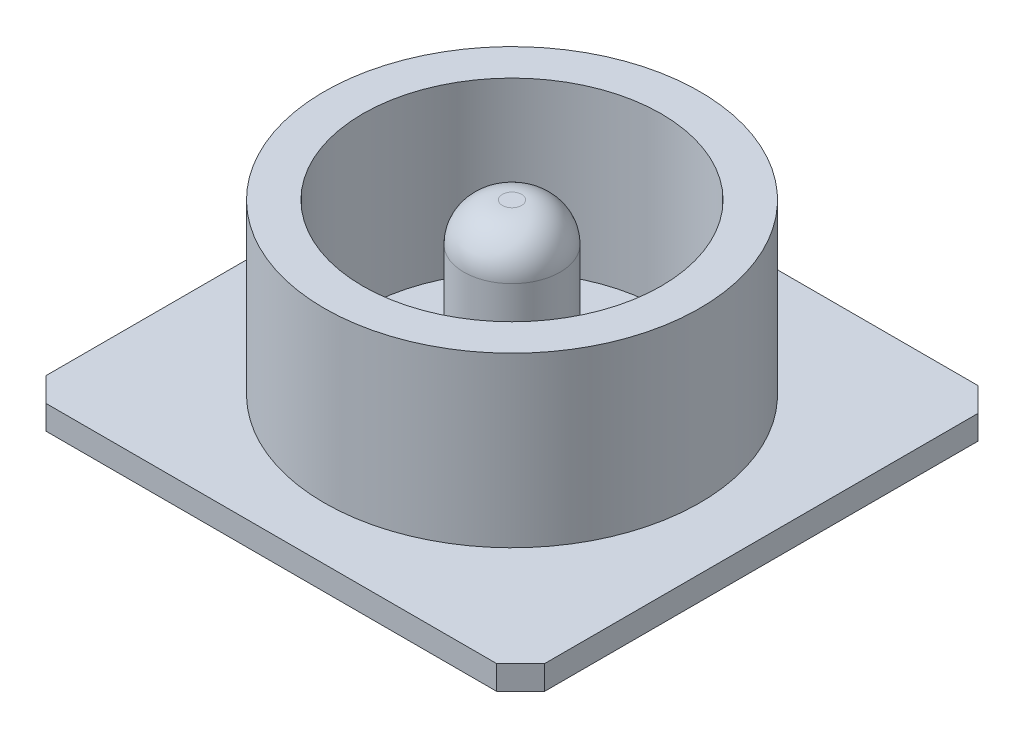
ISO-10303-21;
HEADER;
FILE_DESCRIPTION(('STEP AP214'),'2;1');
FILE_NAME('part.step','',(''),(''),'','','');
FILE_SCHEMA(('AUTOMOTIVE_DESIGN { 1 0 10303 214 1 1 1 1 }'));
ENDSEC;
DATA;
#1=APPLICATION_CONTEXT('core data for automotive mechanical design processes');
#2=APPLICATION_PROTOCOL_DEFINITION('international standard','automotive_design',2000,#1);
#3=PRODUCT_CONTEXT('',#1,'mechanical');
#4=PRODUCT('Part','Part','',(#3));
#5=PRODUCT_RELATED_PRODUCT_CATEGORY('part','',(#4));
#6=PRODUCT_DEFINITION_FORMATION('','',#4);
#7=PRODUCT_DEFINITION_CONTEXT('part definition',#1,'design');
#8=PRODUCT_DEFINITION('design','',#6,#7);
#9=PRODUCT_DEFINITION_SHAPE('','',#8);
#10=(LENGTH_UNIT() NAMED_UNIT(*) SI_UNIT(.MILLI.,.METRE.));
#11=(NAMED_UNIT(*) PLANE_ANGLE_UNIT() SI_UNIT($,.RADIAN.));
#12=(NAMED_UNIT(*) SI_UNIT($,.STERADIAN.) SOLID_ANGLE_UNIT());
#13=UNCERTAINTY_MEASURE_WITH_UNIT(LENGTH_MEASURE(1.E-05),#10,'distance_accuracy_value','');
#14=(GEOMETRIC_REPRESENTATION_CONTEXT(3) GLOBAL_UNCERTAINTY_ASSIGNED_CONTEXT((#13)) GLOBAL_UNIT_ASSIGNED_CONTEXT((#10,
#11,#12)) REPRESENTATION_CONTEXT('',''));
#15=CARTESIAN_POINT('',(0.,0.,0.));
#16=DIRECTION('',(0.,0.,1.));
#17=DIRECTION('',(1.,0.,0.));
#18=AXIS2_PLACEMENT_3D('',#15,#16,#17);
#19=CARTESIAN_POINT('',(1.31553605108081,0.,1.27));
#20=DIRECTION('',(0.,1.,0.));
#21=DIRECTION('',(0.,0.,1.));
#22=AXIS2_PLACEMENT_3D('',#19,#20,#21);
#23=PLANE('',#22);
#24=DIRECTION('',(0.,0.,1.));
#25=VECTOR('',#24,1.);
#26=CARTESIAN_POINT('',(-1.31553605108081,0.,-1.27));
#27=LINE('',#26,#25);
#28=CARTESIAN_POINT('',(-1.31553605108081,0.,-1.143));
#29=VERTEX_POINT('',#28);
#30=CARTESIAN_POINT('',(-1.31553605108081,0.,1.143));
#31=VERTEX_POINT('',#30);
#32=EDGE_CURVE('E101',#29,#31,#27,.T.);
#33=ORIENTED_EDGE('',*,*,#32,.T.);
#34=DIRECTION('',(-0.70710678118655,0.,-0.707106781186545));
#35=VECTOR('',#34,1.);
#36=CARTESIAN_POINT('',(0.0635000000000104,0.,2.52203605108081));
#37=LINE('',#36,#35);
#38=CARTESIAN_POINT('',(-1.18853605108081,0.,1.27));
#39=VERTEX_POINT('',#38);
#40=EDGE_CURVE('E108',#31,#39,#37,.F.);
#41=ORIENTED_EDGE('',*,*,#40,.T.);
#42=DIRECTION('',(1.,0.,0.));
#43=VECTOR('',#42,1.);
#44=CARTESIAN_POINT('',(-1.31553605108081,0.,1.27));
#45=LINE('',#44,#43);
#46=CARTESIAN_POINT('',(1.18853605108081,0.,1.27));
#47=VERTEX_POINT('',#46);
#48=EDGE_CURVE('E159',#39,#47,#45,.T.);
#49=ORIENTED_EDGE('',*,*,#48,.T.);
#50=DIRECTION('',(-0.707106781186545,0.,0.70710678118655));
#51=VECTOR('',#50,1.);
#52=CARTESIAN_POINT('',(1.25203605108081,0.,1.2065));
#53=LINE('',#52,#51);
#54=CARTESIAN_POINT('',(1.31553605108081,0.,1.143));
#55=VERTEX_POINT('',#54);
#56=EDGE_CURVE('E109',#47,#55,#53,.F.);
#57=ORIENTED_EDGE('',*,*,#56,.T.);
#58=DIRECTION('',(0.,0.,-1.));
#59=VECTOR('',#58,1.);
#60=CARTESIAN_POINT('',(1.31553605108081,0.,1.27));
#61=LINE('',#60,#59);
#62=CARTESIAN_POINT('',(1.31553605108081,0.,-1.143));
#63=VERTEX_POINT('',#62);
#64=EDGE_CURVE('E155',#55,#63,#61,.T.);
#65=ORIENTED_EDGE('',*,*,#64,.T.);
#66=DIRECTION('',(0.70710678118655,0.,0.707106781186545));
#67=VECTOR('',#66,1.);
#68=CARTESIAN_POINT('',(2.52203605108081,0.,0.0634999999999928));
#69=LINE('',#68,#67);
#70=CARTESIAN_POINT('',(1.18853605108081,0.,-1.27));
#71=VERTEX_POINT('',#70);
#72=EDGE_CURVE('E126',#63,#71,#69,.F.);
#73=ORIENTED_EDGE('',*,*,#72,.T.);
#74=DIRECTION('',(-1.,0.,0.));
#75=VECTOR('',#74,1.);
#76=CARTESIAN_POINT('',(1.31553605108081,0.,-1.27));
#77=LINE('',#76,#75);
#78=CARTESIAN_POINT('',(-1.18853605108081,0.,-1.27));
#79=VERTEX_POINT('',#78);
#80=EDGE_CURVE('E103',#71,#79,#77,.T.);
#81=ORIENTED_EDGE('',*,*,#80,.T.);
#82=DIRECTION('',(0.707106781186545,0.,-0.70710678118655));
#83=VECTOR('',#82,1.);
#84=CARTESIAN_POINT('',(-1.20650000000001,0.,-1.2520360510808));
#85=LINE('',#84,#83);
#86=EDGE_CURVE('E98',#79,#29,#85,.F.);
#87=ORIENTED_EDGE('',*,*,#86,.T.);
#88=EDGE_LOOP('',(#33,#41,#49,#57,#65,#73,#81,#87));
#89=FACE_BOUND('',#88,.T.);
#90=CARTESIAN_POINT('',(0.,0.,0.));
#91=DIRECTION('',(0.,1.,0.));
#92=DIRECTION('',(0.,0.,1.));
#93=AXIS2_PLACEMENT_3D('',#90,#91,#92);
#94=CIRCLE('',#93,0.990599999999999);
#95=CARTESIAN_POINT('',(0.,0.,0.9906));
#96=VERTEX_POINT('',#95);
#97=EDGE_CURVE('E169',#96,#96,#94,.T.);
#98=ORIENTED_EDGE('',*,*,#97,.F.);
#99=EDGE_LOOP('',(#98));
#100=FACE_BOUND('',#99,.T.);
#101=ADVANCED_FACE('F32',(#89,#100),#23,.T.);
#102=CARTESIAN_POINT('',(-1.31553605108081,-0.127,1.27));
#103=DIRECTION('',(0.,0.,1.));
#104=DIRECTION('',(1.,0.,0.));
#105=AXIS2_PLACEMENT_3D('',#102,#103,#104);
#106=PLANE('',#105);
#107=ORIENTED_EDGE('',*,*,#48,.F.);
#108=DIRECTION('',(0.,-1.,0.));
#109=VECTOR('',#108,1.);
#110=CARTESIAN_POINT('',(-1.18853605108081,-0.127,1.27));
#111=LINE('',#110,#109);
#112=CARTESIAN_POINT('',(-1.18853605108081,-0.127,1.27));
#113=VERTEX_POINT('',#112);
#114=EDGE_CURVE('E138',#39,#113,#111,.T.);
#115=ORIENTED_EDGE('',*,*,#114,.T.);
#116=DIRECTION('',(1.,0.,0.));
#117=VECTOR('',#116,1.);
#118=CARTESIAN_POINT('',(-1.31553605108081,-0.127,1.27));
#119=LINE('',#118,#117);
#120=CARTESIAN_POINT('',(1.18853605108081,-0.127,1.27));
#121=VERTEX_POINT('',#120);
#122=EDGE_CURVE('E119',#113,#121,#119,.T.);
#123=ORIENTED_EDGE('',*,*,#122,.T.);
#124=DIRECTION('',(0.,1.,0.));
#125=VECTOR('',#124,1.);
#126=CARTESIAN_POINT('',(1.18853605108081,-0.127,1.27));
#127=LINE('',#126,#125);
#128=EDGE_CURVE('E135',#121,#47,#127,.T.);
#129=ORIENTED_EDGE('',*,*,#128,.T.);
#130=EDGE_LOOP('',(#107,#115,#123,#129));
#131=FACE_BOUND('',#130,.T.);
#132=ADVANCED_FACE('F204',(#131),#106,.T.);
#133=CARTESIAN_POINT('',(-1.31553605108081,-0.127,-1.27));
#134=DIRECTION('',(-1.,0.,0.));
#135=DIRECTION('',(0.,0.,1.));
#136=AXIS2_PLACEMENT_3D('',#133,#134,#135);
#137=PLANE('',#136);
#138=DIRECTION('',(0.,0.,1.));
#139=VECTOR('',#138,1.);
#140=CARTESIAN_POINT('',(-1.31553605108081,-0.127,-1.27));
#141=LINE('',#140,#139);
#142=CARTESIAN_POINT('',(-1.31553605108081,-0.127,-1.143));
#143=VERTEX_POINT('',#142);
#144=CARTESIAN_POINT('',(-1.31553605108081,-0.127,1.143));
#145=VERTEX_POINT('',#144);
#146=EDGE_CURVE('E124',#143,#145,#141,.T.);
#147=ORIENTED_EDGE('',*,*,#146,.T.);
#148=DIRECTION('',(0.,1.,0.));
#149=VECTOR('',#148,1.);
#150=CARTESIAN_POINT('',(-1.31553605108081,-0.127,1.143));
#151=LINE('',#150,#149);
#152=EDGE_CURVE('E118',#145,#31,#151,.T.);
#153=ORIENTED_EDGE('',*,*,#152,.T.);
#154=ORIENTED_EDGE('',*,*,#32,.F.);
#155=DIRECTION('',(0.,-1.,0.));
#156=VECTOR('',#155,1.);
#157=CARTESIAN_POINT('',(-1.31553605108081,-0.127,-1.143));
#158=LINE('',#157,#156);
#159=EDGE_CURVE('E115',#29,#143,#158,.T.);
#160=ORIENTED_EDGE('',*,*,#159,.T.);
#161=EDGE_LOOP('',(#147,#153,#154,#160));
#162=FACE_BOUND('',#161,.T.);
#163=ADVANCED_FACE('F114',(#162),#137,.T.);
#164=CARTESIAN_POINT('',(1.31553605108081,-0.127,-1.27));
#165=DIRECTION('',(0.,0.,-1.));
#166=DIRECTION('',(-1.,0.,0.));
#167=AXIS2_PLACEMENT_3D('',#164,#165,#166);
#168=PLANE('',#167);
#169=DIRECTION('',(-1.,0.,0.));
#170=VECTOR('',#169,1.);
#171=CARTESIAN_POINT('',(1.31553605108081,-0.127,-1.27));
#172=LINE('',#171,#170);
#173=CARTESIAN_POINT('',(1.18853605108081,-0.127,-1.27));
#174=VERTEX_POINT('',#173);
#175=CARTESIAN_POINT('',(-1.18853605108081,-0.127,-1.27));
#176=VERTEX_POINT('',#175);
#177=EDGE_CURVE('E128',#174,#176,#172,.T.);
#178=ORIENTED_EDGE('',*,*,#177,.T.);
#179=DIRECTION('',(0.,1.,0.));
#180=VECTOR('',#179,1.);
#181=CARTESIAN_POINT('',(-1.18853605108081,-0.127,-1.27));
#182=LINE('',#181,#180);
#183=EDGE_CURVE('E148',#176,#79,#182,.T.);
#184=ORIENTED_EDGE('',*,*,#183,.T.);
#185=ORIENTED_EDGE('',*,*,#80,.F.);
#186=DIRECTION('',(0.,-1.,0.));
#187=VECTOR('',#186,1.);
#188=CARTESIAN_POINT('',(1.18853605108081,-0.127,-1.27));
#189=LINE('',#188,#187);
#190=EDGE_CURVE('E146',#71,#174,#189,.T.);
#191=ORIENTED_EDGE('',*,*,#190,.T.);
#192=EDGE_LOOP('',(#178,#184,#185,#191));
#193=FACE_BOUND('',#192,.T.);
#194=ADVANCED_FACE('F217',(#193),#168,.T.);
#195=CARTESIAN_POINT('',(1.31553605108081,-0.127,1.27));
#196=DIRECTION('',(1.,0.,0.));
#197=DIRECTION('',(0.,0.,-1.));
#198=AXIS2_PLACEMENT_3D('',#195,#196,#197);
#199=PLANE('',#198);
#200=ORIENTED_EDGE('',*,*,#64,.F.);
#201=DIRECTION('',(0.,-1.,0.));
#202=VECTOR('',#201,1.);
#203=CARTESIAN_POINT('',(1.31553605108081,-0.127,1.143));
#204=LINE('',#203,#202);
#205=CARTESIAN_POINT('',(1.31553605108081,-0.127,1.143));
#206=VERTEX_POINT('',#205);
#207=EDGE_CURVE('E40',#55,#206,#204,.T.);
#208=ORIENTED_EDGE('',*,*,#207,.T.);
#209=DIRECTION('',(0.,0.,-1.));
#210=VECTOR('',#209,1.);
#211=CARTESIAN_POINT('',(1.31553605108081,-0.127,1.27));
#212=LINE('',#211,#210);
#213=CARTESIAN_POINT('',(1.31553605108081,-0.127,-1.143));
#214=VERTEX_POINT('',#213);
#215=EDGE_CURVE('E156',#206,#214,#212,.T.);
#216=ORIENTED_EDGE('',*,*,#215,.T.);
#217=DIRECTION('',(0.,1.,0.));
#218=VECTOR('',#217,1.);
#219=CARTESIAN_POINT('',(1.31553605108081,-0.127,-1.143));
#220=LINE('',#219,#218);
#221=EDGE_CURVE('E150',#214,#63,#220,.T.);
#222=ORIENTED_EDGE('',*,*,#221,.T.);
#223=EDGE_LOOP('',(#200,#208,#216,#222));
#224=FACE_BOUND('',#223,.T.);
#225=ADVANCED_FACE('F154',(#224),#199,.T.);
#226=CARTESIAN_POINT('',(1.31553605108081,-0.127,1.27));
#227=DIRECTION('',(0.,1.,0.));
#228=DIRECTION('',(0.,0.,1.));
#229=AXIS2_PLACEMENT_3D('',#226,#227,#228);
#230=PLANE('',#229);
#231=ORIENTED_EDGE('',*,*,#122,.F.);
#232=DIRECTION('',(0.70710678118655,0.,0.707106781186545));
#233=VECTOR('',#232,1.);
#234=CARTESIAN_POINT('',(-1.31553605108081,-0.127,1.143));
#235=LINE('',#234,#233);
#236=EDGE_CURVE('E144',#113,#145,#235,.F.);
#237=ORIENTED_EDGE('',*,*,#236,.T.);
#238=ORIENTED_EDGE('',*,*,#146,.F.);
#239=DIRECTION('',(-0.707106781186545,0.,0.70710678118655));
#240=VECTOR('',#239,1.);
#241=CARTESIAN_POINT('',(-1.18853605108081,-0.127,-1.27));
#242=LINE('',#241,#240);
#243=EDGE_CURVE('E123',#143,#176,#242,.F.);
#244=ORIENTED_EDGE('',*,*,#243,.T.);
#245=ORIENTED_EDGE('',*,*,#177,.F.);
#246=DIRECTION('',(-0.70710678118655,0.,-0.707106781186545));
#247=VECTOR('',#246,1.);
#248=CARTESIAN_POINT('',(1.31553605108081,-0.127,-1.143));
#249=LINE('',#248,#247);
#250=EDGE_CURVE('E47',#174,#214,#249,.F.);
#251=ORIENTED_EDGE('',*,*,#250,.T.);
#252=ORIENTED_EDGE('',*,*,#215,.F.);
#253=DIRECTION('',(0.707106781186545,0.,-0.70710678118655));
#254=VECTOR('',#253,1.);
#255=CARTESIAN_POINT('',(1.18853605108081,-0.127,1.27));
#256=LINE('',#255,#254);
#257=EDGE_CURVE('E141',#206,#121,#256,.F.);
#258=ORIENTED_EDGE('',*,*,#257,.T.);
#259=EDGE_LOOP('',(#231,#237,#238,#244,#245,#251,#252,#258));
#260=FACE_BOUND('',#259,.T.);
#261=ADVANCED_FACE('F213',(#260),#230,.F.);
#262=CARTESIAN_POINT('',(0.,0.889,0.));
#263=DIRECTION('',(0.,-1.,0.));
#264=DIRECTION('',(0.,0.,-1.));
#265=AXIS2_PLACEMENT_3D('',#262,#263,#264);
#266=CYLINDRICAL_SURFACE('',#265,0.990599999999999);
#267=CARTESIAN_POINT('',(0.,0.889,0.));
#268=DIRECTION('',(0.,1.,0.));
#269=DIRECTION('',(0.,0.,1.));
#270=AXIS2_PLACEMENT_3D('',#267,#268,#269);
#271=CIRCLE('',#270,0.990599999999999);
#272=CARTESIAN_POINT('',(0.,0.889,0.9906));
#273=VERTEX_POINT('',#272);
#274=EDGE_CURVE('E161',#273,#273,#271,.T.);
#275=ORIENTED_EDGE('',*,*,#274,.F.);
#276=EDGE_LOOP('',(#275));
#277=FACE_BOUND('',#276,.T.);
#278=ORIENTED_EDGE('',*,*,#97,.T.);
#279=EDGE_LOOP('',(#278));
#280=FACE_BOUND('',#279,.T.);
#281=ADVANCED_FACE('F244',(#277,#280),#266,.T.);
#282=CARTESIAN_POINT('',(0.,0.889,0.));
#283=DIRECTION('',(0.,1.,0.));
#284=DIRECTION('',(0.,0.,1.));
#285=AXIS2_PLACEMENT_3D('',#282,#283,#284);
#286=PLANE('',#285);
#287=CARTESIAN_POINT('',(0.,0.889000000000001,0.));
#288=DIRECTION('',(0.,1.,0.));
#289=DIRECTION('',(0.,0.,1.));
#290=AXIS2_PLACEMENT_3D('',#287,#288,#289);
#291=CIRCLE('',#290,0.787400000000015);
#292=CARTESIAN_POINT('',(0.,0.889000000000001,0.787400000000015));
#293=VERTEX_POINT('',#292);
#294=EDGE_CURVE('E172',#293,#293,#291,.T.);
#295=ORIENTED_EDGE('',*,*,#294,.F.);
#296=EDGE_LOOP('',(#295));
#297=FACE_BOUND('',#296,.T.);
#298=ORIENTED_EDGE('',*,*,#274,.T.);
#299=EDGE_LOOP('',(#298));
#300=FACE_BOUND('',#299,.T.);
#301=ADVANCED_FACE('F248',(#297,#300),#286,.T.);
#302=CARTESIAN_POINT('',(0.,0.889,0.));
#303=DIRECTION('',(0.,1.,0.));
#304=DIRECTION('',(0.,0.,1.));
#305=AXIS2_PLACEMENT_3D('',#302,#303,#304);
#306=CYLINDRICAL_SURFACE('',#305,0.787400000000014);
#307=CARTESIAN_POINT('',(0.,0.,0.));
#308=DIRECTION('',(0.,1.,0.));
#309=DIRECTION('',(0.,0.,1.));
#310=AXIS2_PLACEMENT_3D('',#307,#308,#309);
#311=CIRCLE('',#310,0.787400000000013);
#312=CARTESIAN_POINT('',(0.,0.,0.787400000000013));
#313=VERTEX_POINT('',#312);
#314=EDGE_CURVE('E177',#313,#313,#311,.F.);
#315=ORIENTED_EDGE('',*,*,#314,.T.);
#316=EDGE_LOOP('',(#315));
#317=FACE_BOUND('',#316,.T.);
#318=ORIENTED_EDGE('',*,*,#294,.T.);
#319=EDGE_LOOP('',(#318));
#320=FACE_BOUND('',#319,.T.);
#321=ADVANCED_FACE('F226',(#317,#320),#306,.F.);
#322=CARTESIAN_POINT('',(-1.31553605108081,-0.127,1.143));
#323=DIRECTION('',(0.707106781186545,0.,-0.70710678118655));
#324=DIRECTION('',(-0.70710678118655,0.,-0.707106781186545));
#325=AXIS2_PLACEMENT_3D('',#322,#323,#324);
#326=PLANE('',#325);
#327=ORIENTED_EDGE('',*,*,#236,.F.);
#328=ORIENTED_EDGE('',*,*,#114,.F.);
#329=ORIENTED_EDGE('',*,*,#40,.F.);
#330=ORIENTED_EDGE('',*,*,#152,.F.);
#331=EDGE_LOOP('',(#327,#328,#329,#330));
#332=FACE_BOUND('',#331,.T.);
#333=ADVANCED_FACE('F223',(#332),#326,.F.);
#334=CARTESIAN_POINT('',(-1.18853605108081,-0.127,-1.27));
#335=DIRECTION('',(0.70710678118655,0.,0.707106781186545));
#336=DIRECTION('',(0.707106781186545,0.,-0.70710678118655));
#337=AXIS2_PLACEMENT_3D('',#334,#335,#336);
#338=PLANE('',#337);
#339=ORIENTED_EDGE('',*,*,#243,.F.);
#340=ORIENTED_EDGE('',*,*,#159,.F.);
#341=ORIENTED_EDGE('',*,*,#86,.F.);
#342=ORIENTED_EDGE('',*,*,#183,.F.);
#343=EDGE_LOOP('',(#339,#340,#341,#342));
#344=FACE_BOUND('',#343,.T.);
#345=ADVANCED_FACE('F122',(#344),#338,.F.);
#346=CARTESIAN_POINT('',(1.18853605108081,-0.127,1.27));
#347=DIRECTION('',(-0.70710678118655,0.,-0.707106781186545));
#348=DIRECTION('',(-0.707106781186545,0.,0.70710678118655));
#349=AXIS2_PLACEMENT_3D('',#346,#347,#348);
#350=PLANE('',#349);
#351=ORIENTED_EDGE('',*,*,#257,.F.);
#352=ORIENTED_EDGE('',*,*,#207,.F.);
#353=ORIENTED_EDGE('',*,*,#56,.F.);
#354=ORIENTED_EDGE('',*,*,#128,.F.);
#355=EDGE_LOOP('',(#351,#352,#353,#354));
#356=FACE_BOUND('',#355,.T.);
#357=ADVANCED_FACE('F229',(#356),#350,.F.);
#358=CARTESIAN_POINT('',(1.31553605108081,-0.127,-1.143));
#359=DIRECTION('',(-0.707106781186545,0.,0.70710678118655));
#360=DIRECTION('',(0.70710678118655,0.,0.707106781186545));
#361=AXIS2_PLACEMENT_3D('',#358,#359,#360);
#362=PLANE('',#361);
#363=ORIENTED_EDGE('',*,*,#250,.F.);
#364=ORIENTED_EDGE('',*,*,#190,.F.);
#365=ORIENTED_EDGE('',*,*,#72,.F.);
#366=ORIENTED_EDGE('',*,*,#221,.F.);
#367=EDGE_LOOP('',(#363,#364,#365,#366));
#368=FACE_BOUND('',#367,.T.);
#369=ADVANCED_FACE('F34',(#368),#362,.F.);
#370=CARTESIAN_POINT('',(1.31553605108081,0.,1.27));
#371=DIRECTION('',(0.,1.,0.));
#372=DIRECTION('',(0.,0.,1.));
#373=AXIS2_PLACEMENT_3D('',#370,#371,#372);
#374=PLANE('',#373);
#375=CARTESIAN_POINT('',(0.,0.,0.));
#376=DIRECTION('',(0.,1.,0.));
#377=DIRECTION('',(0.,0.,1.));
#378=AXIS2_PLACEMENT_3D('',#375,#376,#377);
#379=CIRCLE('',#378,0.254);
#380=CARTESIAN_POINT('',(0.,0.,0.254));
#381=VERTEX_POINT('',#380);
#382=EDGE_CURVE('E11',#381,#381,#379,.T.);
#383=ORIENTED_EDGE('',*,*,#382,.F.);
#384=EDGE_LOOP('',(#383));
#385=FACE_BOUND('',#384,.T.);
#386=ORIENTED_EDGE('',*,*,#314,.F.);
#387=EDGE_LOOP('',(#386));
#388=FACE_BOUND('',#387,.T.);
#389=ADVANCED_FACE('F235',(#385,#388),#374,.T.);
#390=CARTESIAN_POINT('',(0.,0.889,0.));
#391=DIRECTION('',(0.,-1.,0.));
#392=DIRECTION('',(0.,0.,-1.));
#393=AXIS2_PLACEMENT_3D('',#390,#391,#392);
#394=CYLINDRICAL_SURFACE('',#393,0.254);
#395=CARTESIAN_POINT('',(0.,0.6858,0.));
#396=DIRECTION('',(0.,1.,0.));
#397=DIRECTION('',(0.,0.,1.));
#398=AXIS2_PLACEMENT_3D('',#395,#396,#397);
#399=CIRCLE('',#398,0.254);
#400=CARTESIAN_POINT('',(0.,0.6858,0.254));
#401=VERTEX_POINT('',#400);
#402=EDGE_CURVE('E183',#401,#401,#399,.F.);
#403=ORIENTED_EDGE('',*,*,#402,.T.);
#404=EDGE_LOOP('',(#403));
#405=FACE_BOUND('',#404,.T.);
#406=ORIENTED_EDGE('',*,*,#382,.T.);
#407=EDGE_LOOP('',(#406));
#408=FACE_BOUND('',#407,.T.);
#409=ADVANCED_FACE('F187',(#405,#408),#394,.T.);
#410=CARTESIAN_POINT('',(0.254,0.889,0.));
#411=DIRECTION('',(0.,1.,0.));
#412=DIRECTION('',(0.,0.,1.));
#413=AXIS2_PLACEMENT_3D('',#410,#411,#412);
#414=PLANE('',#413);
#415=CARTESIAN_POINT('',(0.,0.889,0.));
#416=DIRECTION('',(0.,1.,0.));
#417=DIRECTION('',(0.,0.,1.));
#418=AXIS2_PLACEMENT_3D('',#415,#416,#417);
#419=CIRCLE('',#418,0.0507999999999999);
#420=CARTESIAN_POINT('',(0.,0.889,0.0507999999999999));
#421=VERTEX_POINT('',#420);
#422=EDGE_CURVE('E180',#421,#421,#419,.T.);
#423=ORIENTED_EDGE('',*,*,#422,.T.);
#424=EDGE_LOOP('',(#423));
#425=FACE_BOUND('',#424,.T.);
#426=ADVANCED_FACE('F192',(#425),#414,.T.);
#427=CARTESIAN_POINT('',(0.,0.6858,0.));
#428=DIRECTION('',(0.,1.,0.));
#429=DIRECTION('',(0.,0.,1.));
#430=AXIS2_PLACEMENT_3D('',#427,#428,#429);
#431=DEGENERATE_TOROIDAL_SURFACE('',#430,0.0507999999999999,0.2032,.T.);
#432=ORIENTED_EDGE('',*,*,#422,.F.);
#433=EDGE_LOOP('',(#432));
#434=FACE_BOUND('',#433,.T.);
#435=ORIENTED_EDGE('',*,*,#402,.F.);
#436=EDGE_LOOP('',(#435));
#437=FACE_BOUND('',#436,.T.);
#438=ADVANCED_FACE('F190',(#434,#437),#431,.T.);
#439=CLOSED_SHELL('',(#101,#132,#163,#194,#225,#261,#281,#301,#321,#333,#345,#357,#369,#389,
#409,#426,#438));
#440=MANIFOLD_SOLID_BREP('B2',#439);
#441=ADVANCED_BREP_SHAPE_REPRESENTATION('',(#18,#440),#14);
#442=SHAPE_DEFINITION_REPRESENTATION(#9,#441);
ENDSEC;
END-ISO-10303-21;
